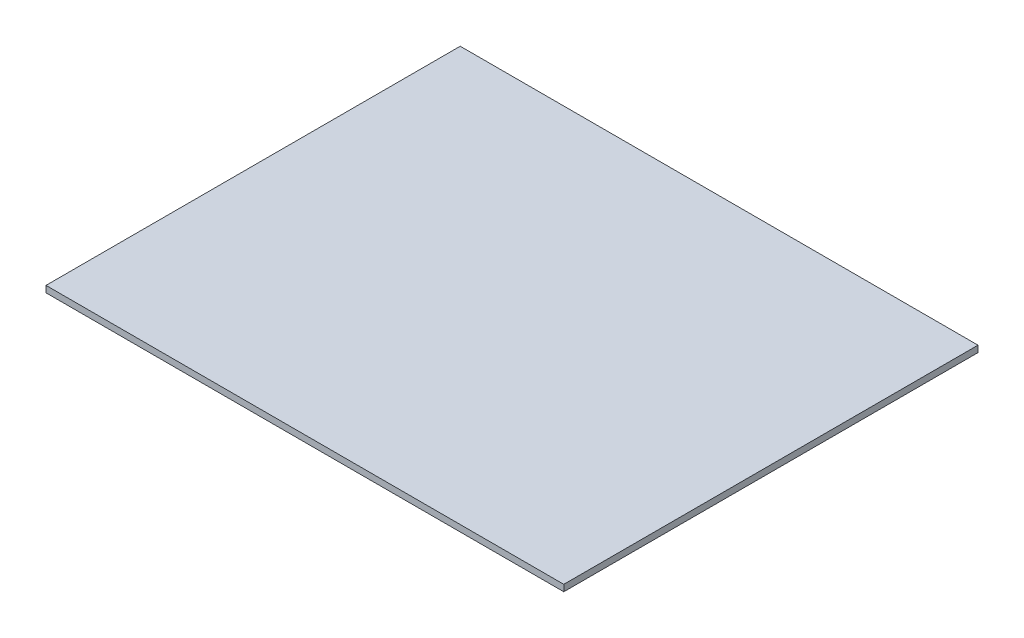
ISO-10303-21;
HEADER;
FILE_DESCRIPTION(('STEP AP214'),'2;1');
FILE_NAME('part.step','',(''),(''),'','','');
FILE_SCHEMA(('AUTOMOTIVE_DESIGN { 1 0 10303 214 1 1 1 1 }'));
ENDSEC;
DATA;
#1=APPLICATION_CONTEXT('core data for automotive mechanical design processes');
#2=APPLICATION_PROTOCOL_DEFINITION('international standard','automotive_design',2000,#1);
#3=PRODUCT_CONTEXT('',#1,'mechanical');
#4=PRODUCT('Part','Part','',(#3));
#5=PRODUCT_RELATED_PRODUCT_CATEGORY('part','',(#4));
#6=PRODUCT_DEFINITION_FORMATION('','',#4);
#7=PRODUCT_DEFINITION_CONTEXT('part definition',#1,'design');
#8=PRODUCT_DEFINITION('design','',#6,#7);
#9=PRODUCT_DEFINITION_SHAPE('','',#8);
#10=(LENGTH_UNIT() NAMED_UNIT(*) SI_UNIT(.MILLI.,.METRE.));
#11=(NAMED_UNIT(*) PLANE_ANGLE_UNIT() SI_UNIT($,.RADIAN.));
#12=(NAMED_UNIT(*) SI_UNIT($,.STERADIAN.) SOLID_ANGLE_UNIT());
#13=UNCERTAINTY_MEASURE_WITH_UNIT(LENGTH_MEASURE(1.E-05),#10,'distance_accuracy_value','');
#14=(GEOMETRIC_REPRESENTATION_CONTEXT(3) GLOBAL_UNCERTAINTY_ASSIGNED_CONTEXT((#13)) GLOBAL_UNIT_ASSIGNED_CONTEXT((#10,
#11,#12)) REPRESENTATION_CONTEXT('',''));
#15=CARTESIAN_POINT('',(0.,0.,0.));
#16=DIRECTION('',(0.,0.,1.));
#17=DIRECTION('',(1.,0.,0.));
#18=AXIS2_PLACEMENT_3D('',#15,#16,#17);
#19=CARTESIAN_POINT('',(381.,9.525,-304.8));
#20=DIRECTION('',(-1.,0.,0.));
#21=DIRECTION('',(0.,0.,1.));
#22=AXIS2_PLACEMENT_3D('',#19,#20,#21);
#23=PLANE('',#22);
#24=DIRECTION('',(0.,0.,-1.));
#25=VECTOR('',#24,1.);
#26=CARTESIAN_POINT('',(381.,0.,-304.8));
#27=LINE('',#26,#25);
#28=CARTESIAN_POINT('',(381.,0.,304.8));
#29=VERTEX_POINT('',#28);
#30=CARTESIAN_POINT('',(381.,0.,-304.8));
#31=VERTEX_POINT('',#30);
#32=EDGE_CURVE('E111',#29,#31,#27,.T.);
#33=ORIENTED_EDGE('',*,*,#32,.T.);
#34=DIRECTION('',(0.,-1.,0.));
#35=VECTOR('',#34,1.);
#36=CARTESIAN_POINT('',(381.,9.525,-304.8));
#37=LINE('',#36,#35);
#38=CARTESIAN_POINT('',(381.,9.525,-304.8));
#39=VERTEX_POINT('',#38);
#40=EDGE_CURVE('E11',#39,#31,#37,.T.);
#41=ORIENTED_EDGE('',*,*,#40,.F.);
#42=DIRECTION('',(0.,0.,-1.));
#43=VECTOR('',#42,1.);
#44=CARTESIAN_POINT('',(381.,9.525,-304.8));
#45=LINE('',#44,#43);
#46=CARTESIAN_POINT('',(381.,9.525,304.8));
#47=VERTEX_POINT('',#46);
#48=EDGE_CURVE('E95',#47,#39,#45,.T.);
#49=ORIENTED_EDGE('',*,*,#48,.F.);
#50=DIRECTION('',(0.,-1.,0.));
#51=VECTOR('',#50,1.);
#52=CARTESIAN_POINT('',(381.,9.525,304.8));
#53=LINE('',#52,#51);
#54=EDGE_CURVE('E107',#47,#29,#53,.T.);
#55=ORIENTED_EDGE('',*,*,#54,.T.);
#56=EDGE_LOOP('',(#33,#41,#49,#55));
#57=FACE_BOUND('',#56,.T.);
#58=ADVANCED_FACE('F43',(#57),#23,.F.);
#59=CARTESIAN_POINT('',(-381.,9.525,-304.8));
#60=DIRECTION('',(0.,0.,1.));
#61=DIRECTION('',(1.,0.,0.));
#62=AXIS2_PLACEMENT_3D('',#59,#60,#61);
#63=PLANE('',#62);
#64=DIRECTION('',(-1.,0.,0.));
#65=VECTOR('',#64,1.);
#66=CARTESIAN_POINT('',(-381.,0.,-304.8));
#67=LINE('',#66,#65);
#68=CARTESIAN_POINT('',(-381.,0.,-304.8));
#69=VERTEX_POINT('',#68);
#70=EDGE_CURVE('E100',#31,#69,#67,.T.);
#71=ORIENTED_EDGE('',*,*,#70,.T.);
#72=DIRECTION('',(0.,-1.,0.));
#73=VECTOR('',#72,1.);
#74=CARTESIAN_POINT('',(-381.,9.525,-304.8));
#75=LINE('',#74,#73);
#76=CARTESIAN_POINT('',(-381.,9.525,-304.8));
#77=VERTEX_POINT('',#76);
#78=EDGE_CURVE('E52',#77,#69,#75,.T.);
#79=ORIENTED_EDGE('',*,*,#78,.F.);
#80=DIRECTION('',(-1.,0.,0.));
#81=VECTOR('',#80,1.);
#82=CARTESIAN_POINT('',(-381.,9.525,-304.8));
#83=LINE('',#82,#81);
#84=EDGE_CURVE('E90',#39,#77,#83,.T.);
#85=ORIENTED_EDGE('',*,*,#84,.F.);
#86=ORIENTED_EDGE('',*,*,#40,.T.);
#87=EDGE_LOOP('',(#71,#79,#85,#86));
#88=FACE_BOUND('',#87,.T.);
#89=ADVANCED_FACE('F99',(#88),#63,.F.);
#90=CARTESIAN_POINT('',(-381.,9.525,-304.8));
#91=DIRECTION('',(1.,0.,0.));
#92=DIRECTION('',(0.,0.,-1.));
#93=AXIS2_PLACEMENT_3D('',#90,#91,#92);
#94=PLANE('',#93);
#95=DIRECTION('',(0.,0.,1.));
#96=VECTOR('',#95,1.);
#97=CARTESIAN_POINT('',(-381.,0.,-304.8));
#98=LINE('',#97,#96);
#99=CARTESIAN_POINT('',(-381.,0.,304.8));
#100=VERTEX_POINT('',#99);
#101=EDGE_CURVE('E77',#69,#100,#98,.T.);
#102=ORIENTED_EDGE('',*,*,#101,.T.);
#103=DIRECTION('',(0.,-1.,0.));
#104=VECTOR('',#103,1.);
#105=CARTESIAN_POINT('',(-381.,9.525,304.8));
#106=LINE('',#105,#104);
#107=CARTESIAN_POINT('',(-381.,9.525,304.8));
#108=VERTEX_POINT('',#107);
#109=EDGE_CURVE('E102',#108,#100,#106,.T.);
#110=ORIENTED_EDGE('',*,*,#109,.F.);
#111=DIRECTION('',(0.,0.,1.));
#112=VECTOR('',#111,1.);
#113=CARTESIAN_POINT('',(-381.,9.525,-304.8));
#114=LINE('',#113,#112);
#115=EDGE_CURVE('E93',#77,#108,#114,.T.);
#116=ORIENTED_EDGE('',*,*,#115,.F.);
#117=ORIENTED_EDGE('',*,*,#78,.T.);
#118=EDGE_LOOP('',(#102,#110,#116,#117));
#119=FACE_BOUND('',#118,.T.);
#120=ADVANCED_FACE('F103',(#119),#94,.F.);
#121=CARTESIAN_POINT('',(-381.,9.525,304.8));
#122=DIRECTION('',(0.,0.,-1.));
#123=DIRECTION('',(-1.,0.,0.));
#124=AXIS2_PLACEMENT_3D('',#121,#122,#123);
#125=PLANE('',#124);
#126=DIRECTION('',(1.,0.,0.));
#127=VECTOR('',#126,1.);
#128=CARTESIAN_POINT('',(-381.,0.,304.8));
#129=LINE('',#128,#127);
#130=EDGE_CURVE('E83',#100,#29,#129,.T.);
#131=ORIENTED_EDGE('',*,*,#130,.T.);
#132=ORIENTED_EDGE('',*,*,#54,.F.);
#133=DIRECTION('',(1.,0.,0.));
#134=VECTOR('',#133,1.);
#135=CARTESIAN_POINT('',(-381.,9.525,304.8));
#136=LINE('',#135,#134);
#137=EDGE_CURVE('E60',#108,#47,#136,.T.);
#138=ORIENTED_EDGE('',*,*,#137,.F.);
#139=ORIENTED_EDGE('',*,*,#109,.T.);
#140=EDGE_LOOP('',(#131,#132,#138,#139));
#141=FACE_BOUND('',#140,.T.);
#142=ADVANCED_FACE('F124',(#141),#125,.F.);
#143=CARTESIAN_POINT('',(0.,9.525,0.));
#144=DIRECTION('',(0.,1.,0.));
#145=DIRECTION('',(0.,0.,1.));
#146=AXIS2_PLACEMENT_3D('',#143,#144,#145);
#147=PLANE('',#146);
#148=ORIENTED_EDGE('',*,*,#48,.T.);
#149=ORIENTED_EDGE('',*,*,#84,.T.);
#150=ORIENTED_EDGE('',*,*,#115,.T.);
#151=ORIENTED_EDGE('',*,*,#137,.T.);
#152=EDGE_LOOP('',(#148,#149,#150,#151));
#153=FACE_BOUND('',#152,.T.);
#154=ADVANCED_FACE('F91',(#153),#147,.T.);
#155=CARTESIAN_POINT('',(0.,0.,0.));
#156=DIRECTION('',(0.,1.,0.));
#157=DIRECTION('',(0.,0.,1.));
#158=AXIS2_PLACEMENT_3D('',#155,#156,#157);
#159=PLANE('',#158);
#160=ORIENTED_EDGE('',*,*,#32,.F.);
#161=ORIENTED_EDGE('',*,*,#130,.F.);
#162=ORIENTED_EDGE('',*,*,#101,.F.);
#163=ORIENTED_EDGE('',*,*,#70,.F.);
#164=EDGE_LOOP('',(#160,#161,#162,#163));
#165=FACE_BOUND('',#164,.T.);
#166=ADVANCED_FACE('F127',(#165),#159,.F.);
#167=CLOSED_SHELL('',(#58,#89,#120,#142,#154,#166));
#168=MANIFOLD_SOLID_BREP('B2',#167);
#169=ADVANCED_BREP_SHAPE_REPRESENTATION('',(#18,#168),#14);
#170=SHAPE_DEFINITION_REPRESENTATION(#9,#169);
ENDSEC;
END-ISO-10303-21;
